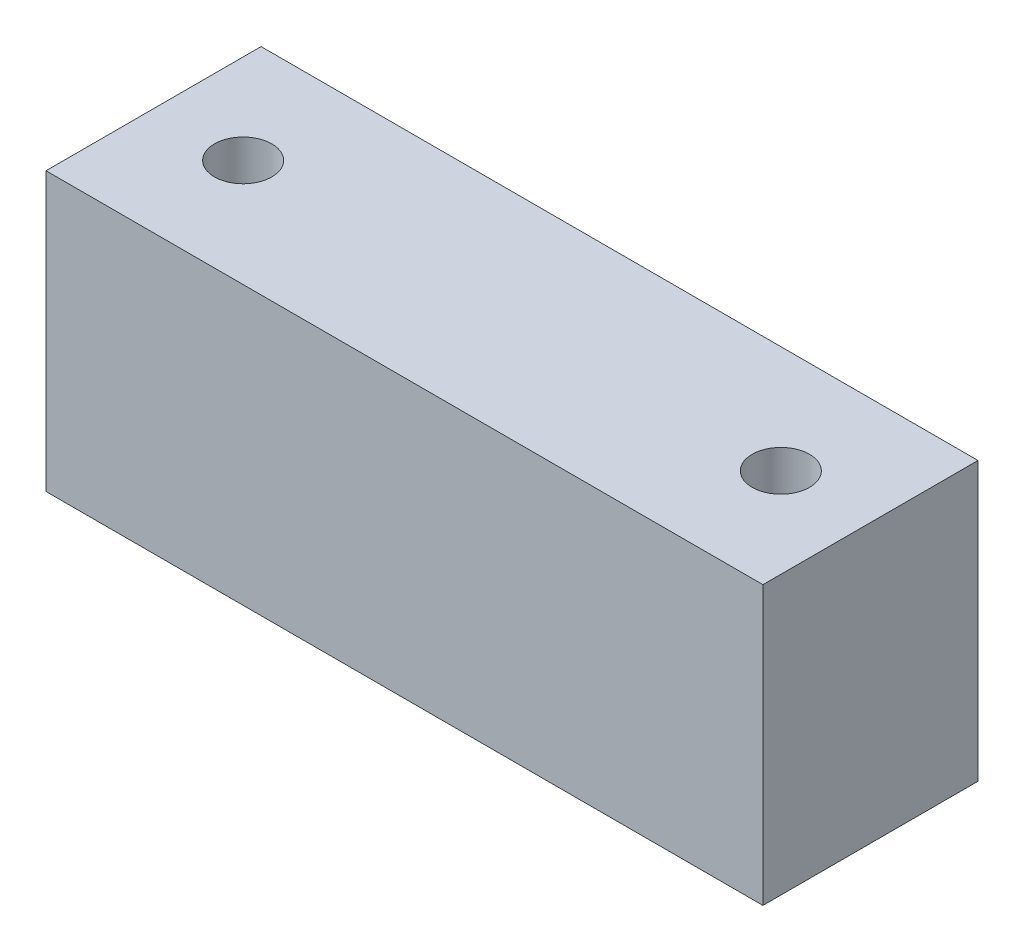
ISO-10303-21;
HEADER;
FILE_DESCRIPTION(('STEP AP214'),'2;1');
FILE_NAME('part.step','',(''),(''),'','','');
FILE_SCHEMA(('AUTOMOTIVE_DESIGN { 1 0 10303 214 1 1 1 1 }'));
ENDSEC;
DATA;
#1=APPLICATION_CONTEXT('core data for automotive mechanical design processes');
#2=APPLICATION_PROTOCOL_DEFINITION('international standard','automotive_design',2000,#1);
#3=PRODUCT_CONTEXT('',#1,'mechanical');
#4=PRODUCT('Part','Part','',(#3));
#5=PRODUCT_RELATED_PRODUCT_CATEGORY('part','',(#4));
#6=PRODUCT_DEFINITION_FORMATION('','',#4);
#7=PRODUCT_DEFINITION_CONTEXT('part definition',#1,'design');
#8=PRODUCT_DEFINITION('design','',#6,#7);
#9=PRODUCT_DEFINITION_SHAPE('','',#8);
#10=(LENGTH_UNIT() NAMED_UNIT(*) SI_UNIT(.MILLI.,.METRE.));
#11=(NAMED_UNIT(*) PLANE_ANGLE_UNIT() SI_UNIT($,.RADIAN.));
#12=(NAMED_UNIT(*) SI_UNIT($,.STERADIAN.) SOLID_ANGLE_UNIT());
#13=UNCERTAINTY_MEASURE_WITH_UNIT(LENGTH_MEASURE(1.E-05),#10,'distance_accuracy_value','');
#14=(GEOMETRIC_REPRESENTATION_CONTEXT(3) GLOBAL_UNCERTAINTY_ASSIGNED_CONTEXT((#13)) GLOBAL_UNIT_ASSIGNED_CONTEXT((#10,
#11,#12)) REPRESENTATION_CONTEXT('',''));
#15=CARTESIAN_POINT('',(0.,0.,0.));
#16=DIRECTION('',(0.,0.,1.));
#17=DIRECTION('',(1.,0.,0.));
#18=AXIS2_PLACEMENT_3D('',#15,#16,#17);
#19=CARTESIAN_POINT('',(20.,15.5,-6.));
#20=DIRECTION('',(-1.,0.,0.));
#21=DIRECTION('',(0.,0.,1.));
#22=AXIS2_PLACEMENT_3D('',#19,#20,#21);
#23=PLANE('',#22);
#24=DIRECTION('',(0.,0.,-1.));
#25=VECTOR('',#24,1.);
#26=CARTESIAN_POINT('',(20.,0.,-6.));
#27=LINE('',#26,#25);
#28=CARTESIAN_POINT('',(20.,0.,6.));
#29=VERTEX_POINT('',#28);
#30=CARTESIAN_POINT('',(20.,0.,-6.));
#31=VERTEX_POINT('',#30);
#32=EDGE_CURVE('E96',#29,#31,#27,.T.);
#33=ORIENTED_EDGE('',*,*,#32,.T.);
#34=DIRECTION('',(0.,-1.,0.));
#35=VECTOR('',#34,1.);
#36=CARTESIAN_POINT('',(20.,15.5,-6.));
#37=LINE('',#36,#35);
#38=CARTESIAN_POINT('',(20.,15.5,-6.));
#39=VERTEX_POINT('',#38);
#40=EDGE_CURVE('E11',#39,#31,#37,.T.);
#41=ORIENTED_EDGE('',*,*,#40,.F.);
#42=DIRECTION('',(0.,0.,-1.));
#43=VECTOR('',#42,1.);
#44=CARTESIAN_POINT('',(20.,15.5,-6.));
#45=LINE('',#44,#43);
#46=CARTESIAN_POINT('',(20.,15.5,6.));
#47=VERTEX_POINT('',#46);
#48=EDGE_CURVE('E84',#47,#39,#45,.T.);
#49=ORIENTED_EDGE('',*,*,#48,.F.);
#50=DIRECTION('',(0.,-1.,0.));
#51=VECTOR('',#50,1.);
#52=CARTESIAN_POINT('',(20.,15.5,6.));
#53=LINE('',#52,#51);
#54=EDGE_CURVE('E92',#47,#29,#53,.T.);
#55=ORIENTED_EDGE('',*,*,#54,.T.);
#56=EDGE_LOOP('',(#33,#41,#49,#55));
#57=FACE_BOUND('',#56,.T.);
#58=ADVANCED_FACE('F33',(#57),#23,.F.);
#59=CARTESIAN_POINT('',(-20.,15.5,-6.));
#60=DIRECTION('',(0.,0.,1.));
#61=DIRECTION('',(1.,0.,0.));
#62=AXIS2_PLACEMENT_3D('',#59,#60,#61);
#63=PLANE('',#62);
#64=DIRECTION('',(-1.,0.,0.));
#65=VECTOR('',#64,1.);
#66=CARTESIAN_POINT('',(-20.,0.,-6.));
#67=LINE('',#66,#65);
#68=CARTESIAN_POINT('',(-20.,0.,-6.));
#69=VERTEX_POINT('',#68);
#70=EDGE_CURVE('E88',#31,#69,#67,.T.);
#71=ORIENTED_EDGE('',*,*,#70,.T.);
#72=DIRECTION('',(0.,-1.,0.));
#73=VECTOR('',#72,1.);
#74=CARTESIAN_POINT('',(-20.,15.5,-6.));
#75=LINE('',#74,#73);
#76=CARTESIAN_POINT('',(-20.,15.5,-6.));
#77=VERTEX_POINT('',#76);
#78=EDGE_CURVE('E41',#77,#69,#75,.T.);
#79=ORIENTED_EDGE('',*,*,#78,.F.);
#80=DIRECTION('',(-1.,0.,0.));
#81=VECTOR('',#80,1.);
#82=CARTESIAN_POINT('',(-20.,15.5,-6.));
#83=LINE('',#82,#81);
#84=EDGE_CURVE('E79',#39,#77,#83,.T.);
#85=ORIENTED_EDGE('',*,*,#84,.F.);
#86=ORIENTED_EDGE('',*,*,#40,.T.);
#87=EDGE_LOOP('',(#71,#79,#85,#86));
#88=FACE_BOUND('',#87,.T.);
#89=ADVANCED_FACE('F87',(#88),#63,.F.);
#90=CARTESIAN_POINT('',(-20.,15.5,-6.));
#91=DIRECTION('',(1.,0.,0.));
#92=DIRECTION('',(0.,0.,-1.));
#93=AXIS2_PLACEMENT_3D('',#90,#91,#92);
#94=PLANE('',#93);
#95=DIRECTION('',(0.,0.,1.));
#96=VECTOR('',#95,1.);
#97=CARTESIAN_POINT('',(-20.,0.,-6.));
#98=LINE('',#97,#96);
#99=CARTESIAN_POINT('',(-20.,0.,6.));
#100=VERTEX_POINT('',#99);
#101=EDGE_CURVE('E66',#69,#100,#98,.T.);
#102=ORIENTED_EDGE('',*,*,#101,.T.);
#103=DIRECTION('',(0.,-1.,0.));
#104=VECTOR('',#103,1.);
#105=CARTESIAN_POINT('',(-20.,15.5,6.));
#106=LINE('',#105,#104);
#107=CARTESIAN_POINT('',(-20.,15.5,6.));
#108=VERTEX_POINT('',#107);
#109=EDGE_CURVE('E89',#108,#100,#106,.T.);
#110=ORIENTED_EDGE('',*,*,#109,.F.);
#111=DIRECTION('',(0.,0.,1.));
#112=VECTOR('',#111,1.);
#113=CARTESIAN_POINT('',(-20.,15.5,-6.));
#114=LINE('',#113,#112);
#115=EDGE_CURVE('E82',#77,#108,#114,.T.);
#116=ORIENTED_EDGE('',*,*,#115,.F.);
#117=ORIENTED_EDGE('',*,*,#78,.T.);
#118=EDGE_LOOP('',(#102,#110,#116,#117));
#119=FACE_BOUND('',#118,.T.);
#120=ADVANCED_FACE('F90',(#119),#94,.F.);
#121=CARTESIAN_POINT('',(-20.,15.5,6.));
#122=DIRECTION('',(0.,0.,-1.));
#123=DIRECTION('',(-1.,0.,0.));
#124=AXIS2_PLACEMENT_3D('',#121,#122,#123);
#125=PLANE('',#124);
#126=DIRECTION('',(1.,0.,0.));
#127=VECTOR('',#126,1.);
#128=CARTESIAN_POINT('',(-20.,0.,6.));
#129=LINE('',#128,#127);
#130=EDGE_CURVE('E72',#100,#29,#129,.T.);
#131=ORIENTED_EDGE('',*,*,#130,.T.);
#132=ORIENTED_EDGE('',*,*,#54,.F.);
#133=DIRECTION('',(1.,0.,0.));
#134=VECTOR('',#133,1.);
#135=CARTESIAN_POINT('',(-20.,15.5,6.));
#136=LINE('',#135,#134);
#137=EDGE_CURVE('E49',#108,#47,#136,.T.);
#138=ORIENTED_EDGE('',*,*,#137,.F.);
#139=ORIENTED_EDGE('',*,*,#109,.T.);
#140=EDGE_LOOP('',(#131,#132,#138,#139));
#141=FACE_BOUND('',#140,.T.);
#142=ADVANCED_FACE('F104',(#141),#125,.F.);
#143=CARTESIAN_POINT('',(0.,15.5,0.));
#144=DIRECTION('',(0.,1.,0.));
#145=DIRECTION('',(0.,0.,1.));
#146=AXIS2_PLACEMENT_3D('',#143,#144,#145);
#147=PLANE('',#146);
#148=CARTESIAN_POINT('',(-15.,15.5,0.));
#149=DIRECTION('',(0.,1.,0.));
#150=DIRECTION('',(0.,0.,-1.));
#151=AXIS2_PLACEMENT_3D('',#148,#149,#150);
#152=CIRCLE('',#151,1.6);
#153=CARTESIAN_POINT('',(-15.,15.5,-1.6));
#154=VERTEX_POINT('',#153);
#155=EDGE_CURVE('E116',#154,#154,#152,.T.);
#156=ORIENTED_EDGE('',*,*,#155,.F.);
#157=EDGE_LOOP('',(#156));
#158=FACE_BOUND('',#157,.T.);
#159=CARTESIAN_POINT('',(15.,15.5,0.));
#160=DIRECTION('',(0.,1.,0.));
#161=DIRECTION('',(0.,0.,1.));
#162=AXIS2_PLACEMENT_3D('',#159,#160,#161);
#163=CIRCLE('',#162,1.6);
#164=CARTESIAN_POINT('',(15.,15.5,1.6));
#165=VERTEX_POINT('',#164);
#166=EDGE_CURVE('E110',#165,#165,#163,.T.);
#167=ORIENTED_EDGE('',*,*,#166,.F.);
#168=EDGE_LOOP('',(#167));
#169=FACE_BOUND('',#168,.T.);
#170=ORIENTED_EDGE('',*,*,#48,.T.);
#171=ORIENTED_EDGE('',*,*,#84,.T.);
#172=ORIENTED_EDGE('',*,*,#115,.T.);
#173=ORIENTED_EDGE('',*,*,#137,.T.);
#174=EDGE_LOOP('',(#170,#171,#172,#173));
#175=FACE_BOUND('',#174,.T.);
#176=ADVANCED_FACE('F80',(#158,#169,#175),#147,.T.);
#177=CARTESIAN_POINT('',(0.,0.,0.));
#178=DIRECTION('',(0.,1.,0.));
#179=DIRECTION('',(0.,0.,1.));
#180=AXIS2_PLACEMENT_3D('',#177,#178,#179);
#181=PLANE('',#180);
#182=CARTESIAN_POINT('',(-15.,0.,0.));
#183=DIRECTION('',(0.,1.,0.));
#184=DIRECTION('',(0.,0.,-1.));
#185=AXIS2_PLACEMENT_3D('',#182,#183,#184);
#186=CIRCLE('',#185,1.6);
#187=CARTESIAN_POINT('',(-15.,0.,-1.6));
#188=VERTEX_POINT('',#187);
#189=EDGE_CURVE('E113',#188,#188,#186,.T.);
#190=ORIENTED_EDGE('',*,*,#189,.T.);
#191=EDGE_LOOP('',(#190));
#192=FACE_BOUND('',#191,.T.);
#193=CARTESIAN_POINT('',(15.,0.,0.));
#194=DIRECTION('',(0.,1.,0.));
#195=DIRECTION('',(0.,0.,1.));
#196=AXIS2_PLACEMENT_3D('',#193,#194,#195);
#197=CIRCLE('',#196,1.6);
#198=CARTESIAN_POINT('',(15.,0.,1.6));
#199=VERTEX_POINT('',#198);
#200=EDGE_CURVE('E99',#199,#199,#197,.T.);
#201=ORIENTED_EDGE('',*,*,#200,.T.);
#202=EDGE_LOOP('',(#201));
#203=FACE_BOUND('',#202,.T.);
#204=ORIENTED_EDGE('',*,*,#32,.F.);
#205=ORIENTED_EDGE('',*,*,#130,.F.);
#206=ORIENTED_EDGE('',*,*,#101,.F.);
#207=ORIENTED_EDGE('',*,*,#70,.F.);
#208=EDGE_LOOP('',(#204,#205,#206,#207));
#209=FACE_BOUND('',#208,.T.);
#210=ADVANCED_FACE('F107',(#192,#203,#209),#181,.F.);
#211=CARTESIAN_POINT('',(15.,0.,0.));
#212=DIRECTION('',(0.,1.,0.));
#213=DIRECTION('',(0.,0.,1.));
#214=AXIS2_PLACEMENT_3D('',#211,#212,#213);
#215=CYLINDRICAL_SURFACE('',#214,1.6);
#216=ORIENTED_EDGE('',*,*,#200,.F.);
#217=EDGE_LOOP('',(#216));
#218=FACE_BOUND('',#217,.T.);
#219=ORIENTED_EDGE('',*,*,#166,.T.);
#220=EDGE_LOOP('',(#219));
#221=FACE_BOUND('',#220,.T.);
#222=ADVANCED_FACE('F127',(#218,#221),#215,.F.);
#223=CARTESIAN_POINT('',(-15.,0.,0.));
#224=DIRECTION('',(0.,1.,0.));
#225=DIRECTION('',(0.,0.,1.));
#226=AXIS2_PLACEMENT_3D('',#223,#224,#225);
#227=CYLINDRICAL_SURFACE('',#226,1.6);
#228=ORIENTED_EDGE('',*,*,#189,.F.);
#229=EDGE_LOOP('',(#228));
#230=FACE_BOUND('',#229,.T.);
#231=ORIENTED_EDGE('',*,*,#155,.T.);
#232=EDGE_LOOP('',(#231));
#233=FACE_BOUND('',#232,.T.);
#234=ADVANCED_FACE('F124',(#230,#233),#227,.F.);
#235=CLOSED_SHELL('',(#58,#89,#120,#142,#176,#210,#222,#234));
#236=MANIFOLD_SOLID_BREP('B2',#235);
#237=ADVANCED_BREP_SHAPE_REPRESENTATION('',(#18,#236),#14);
#238=SHAPE_DEFINITION_REPRESENTATION(#9,#237);
ENDSEC;
END-ISO-10303-21;
